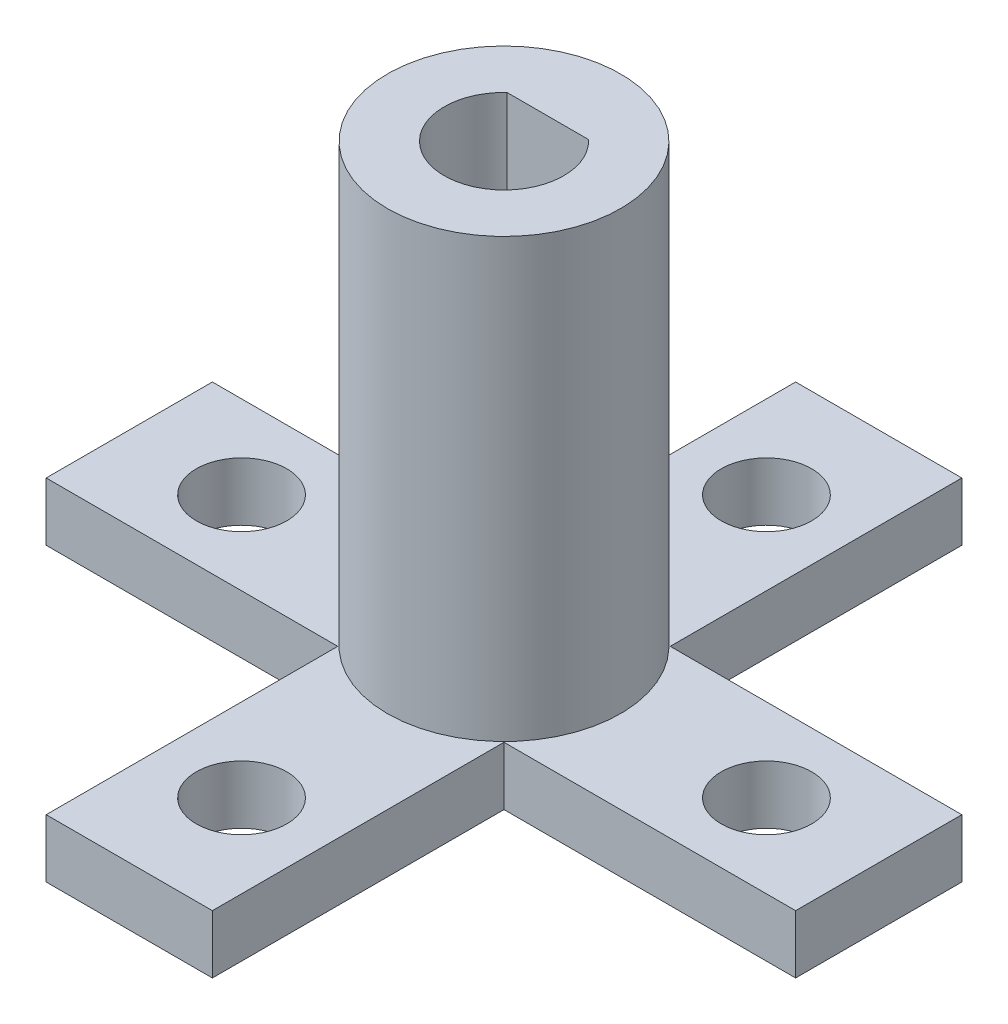
ISO-10303-21;
HEADER;
FILE_DESCRIPTION(('STEP AP214'),'2;1');
FILE_NAME('part.step','',(''),(''),'','','');
FILE_SCHEMA(('AUTOMOTIVE_DESIGN { 1 0 10303 214 1 1 1 1 }'));
ENDSEC;
DATA;
#1=APPLICATION_CONTEXT('core data for automotive mechanical design processes');
#2=APPLICATION_PROTOCOL_DEFINITION('international standard','automotive_design',2000,#1);
#3=PRODUCT_CONTEXT('',#1,'mechanical');
#4=PRODUCT('Part','Part','',(#3));
#5=PRODUCT_RELATED_PRODUCT_CATEGORY('part','',(#4));
#6=PRODUCT_DEFINITION_FORMATION('','',#4);
#7=PRODUCT_DEFINITION_CONTEXT('part definition',#1,'design');
#8=PRODUCT_DEFINITION('design','',#6,#7);
#9=PRODUCT_DEFINITION_SHAPE('','',#8);
#10=(LENGTH_UNIT() NAMED_UNIT(*) SI_UNIT(.MILLI.,.METRE.));
#11=(NAMED_UNIT(*) PLANE_ANGLE_UNIT() SI_UNIT($,.RADIAN.));
#12=(NAMED_UNIT(*) SI_UNIT($,.STERADIAN.) SOLID_ANGLE_UNIT());
#13=UNCERTAINTY_MEASURE_WITH_UNIT(LENGTH_MEASURE(1.E-05),#10,'distance_accuracy_value','');
#14=(GEOMETRIC_REPRESENTATION_CONTEXT(3) GLOBAL_UNCERTAINTY_ASSIGNED_CONTEXT((#13)) GLOBAL_UNIT_ASSIGNED_CONTEXT((#10,
#11,#12)) REPRESENTATION_CONTEXT('',''));
#15=CARTESIAN_POINT('',(0.,0.,0.));
#16=DIRECTION('',(0.,0.,1.));
#17=DIRECTION('',(1.,0.,0.));
#18=AXIS2_PLACEMENT_3D('',#15,#16,#17);
#19=CARTESIAN_POINT('',(0.,0.,-1.5));
#20=DIRECTION('',(0.,0.,1.));
#21=DIRECTION('',(1.,0.,0.));
#22=AXIS2_PLACEMENT_3D('',#19,#20,#21);
#23=PLANE('',#22);
#24=CARTESIAN_POINT('',(0.,13.,-1.5));
#25=DIRECTION('',(0.,0.,1.));
#26=DIRECTION('',(1.,0.,0.));
#27=AXIS2_PLACEMENT_3D('',#24,#25,#26);
#28=CIRCLE('',#27,1.5);
#29=CARTESIAN_POINT('',(1.39731886124821,13.5454356057318,-1.5));
#30=VERTEX_POINT('',#29);
#31=CARTESIAN_POINT('',(-1.39731886124821,13.5454356057318,-1.5));
#32=VERTEX_POINT('',#31);
#33=EDGE_CURVE('E171',#30,#32,#28,.T.);
#34=ORIENTED_EDGE('',*,*,#33,.F.);
#35=DIRECTION('',(0.,1.,0.));
#36=VECTOR('',#35,1.);
#37=CARTESIAN_POINT('',(1.39731886124821,0.,-1.5));
#38=LINE('',#37,#36);
#39=CARTESIAN_POINT('',(1.39731886124821,17.,-1.5));
#40=VERTEX_POINT('',#39);
#41=EDGE_CURVE('E188',#30,#40,#38,.T.);
#42=ORIENTED_EDGE('',*,*,#41,.T.);
#43=DIRECTION('',(1.,0.,0.));
#44=VECTOR('',#43,1.);
#45=CARTESIAN_POINT('',(0.,17.,-1.5));
#46=LINE('',#45,#44);
#47=CARTESIAN_POINT('',(-1.39731886124821,17.,-1.5));
#48=VERTEX_POINT('',#47);
#49=EDGE_CURVE('E179',#48,#40,#46,.T.);
#50=ORIENTED_EDGE('',*,*,#49,.F.);
#51=DIRECTION('',(0.,1.,0.));
#52=VECTOR('',#51,1.);
#53=CARTESIAN_POINT('',(-1.39731886124821,0.,-1.5));
#54=LINE('',#53,#52);
#55=EDGE_CURVE('E164',#32,#48,#54,.T.);
#56=ORIENTED_EDGE('',*,*,#55,.F.);
#57=EDGE_LOOP('',(#34,#42,#50,#56));
#58=FACE_BOUND('',#57,.T.);
#59=ADVANCED_FACE('F47',(#58),#23,.T.);
#60=CARTESIAN_POINT('',(0.,2.,2.85));
#61=DIRECTION('',(0.,0.,-1.));
#62=DIRECTION('',(-1.,0.,0.));
#63=AXIS2_PLACEMENT_3D('',#60,#61,#62);
#64=PLANE('',#63);
#65=DIRECTION('',(1.,0.,0.));
#66=VECTOR('',#65,1.);
#67=CARTESIAN_POINT('',(0.,0.,2.85));
#68=LINE('',#67,#66);
#69=CARTESIAN_POINT('',(-12.85,0.,2.85));
#70=VERTEX_POINT('',#69);
#71=CARTESIAN_POINT('',(-2.85,0.,2.85));
#72=VERTEX_POINT('',#71);
#73=EDGE_CURVE('E265',#70,#72,#68,.T.);
#74=ORIENTED_EDGE('',*,*,#73,.T.);
#75=DIRECTION('',(0.,-1.,0.));
#76=VECTOR('',#75,1.);
#77=CARTESIAN_POINT('',(-2.85,2.,2.85));
#78=LINE('',#77,#76);
#79=CARTESIAN_POINT('',(-2.85,2.,2.85));
#80=VERTEX_POINT('',#79);
#81=EDGE_CURVE('E56',#80,#72,#78,.T.);
#82=ORIENTED_EDGE('',*,*,#81,.F.);
#83=DIRECTION('',(1.,0.,0.));
#84=VECTOR('',#83,1.);
#85=CARTESIAN_POINT('',(0.,2.,2.85));
#86=LINE('',#85,#84);
#87=CARTESIAN_POINT('',(-12.85,2.,2.85));
#88=VERTEX_POINT('',#87);
#89=EDGE_CURVE('E205',#88,#80,#86,.T.);
#90=ORIENTED_EDGE('',*,*,#89,.F.);
#91=DIRECTION('',(0.,-1.,0.));
#92=VECTOR('',#91,1.);
#93=CARTESIAN_POINT('',(-12.85,2.,2.85));
#94=LINE('',#93,#92);
#95=EDGE_CURVE('E261',#88,#70,#94,.T.);
#96=ORIENTED_EDGE('',*,*,#95,.T.);
#97=EDGE_LOOP('',(#74,#82,#90,#96));
#98=FACE_BOUND('',#97,.T.);
#99=ADVANCED_FACE('F364',(#98),#64,.F.);
#100=CARTESIAN_POINT('',(-2.85,2.,0.));
#101=DIRECTION('',(1.,0.,0.));
#102=DIRECTION('',(0.,0.,-1.));
#103=AXIS2_PLACEMENT_3D('',#100,#101,#102);
#104=PLANE('',#103);
#105=DIRECTION('',(0.,0.,1.));
#106=VECTOR('',#105,1.);
#107=CARTESIAN_POINT('',(-2.85,0.,0.));
#108=LINE('',#107,#106);
#109=CARTESIAN_POINT('',(-2.85,0.,12.85));
#110=VERTEX_POINT('',#109);
#111=EDGE_CURVE('E269',#72,#110,#108,.T.);
#112=ORIENTED_EDGE('',*,*,#111,.T.);
#113=DIRECTION('',(0.,-1.,0.));
#114=VECTOR('',#113,1.);
#115=CARTESIAN_POINT('',(-2.85,2.,12.85));
#116=LINE('',#115,#114);
#117=CARTESIAN_POINT('',(-2.85,2.,12.85));
#118=VERTEX_POINT('',#117);
#119=EDGE_CURVE('E352',#118,#110,#116,.T.);
#120=ORIENTED_EDGE('',*,*,#119,.F.);
#121=DIRECTION('',(0.,0.,1.));
#122=VECTOR('',#121,1.);
#123=CARTESIAN_POINT('',(-2.85,2.,0.));
#124=LINE('',#123,#122);
#125=EDGE_CURVE('E210',#80,#118,#124,.T.);
#126=ORIENTED_EDGE('',*,*,#125,.F.);
#127=ORIENTED_EDGE('',*,*,#81,.T.);
#128=EDGE_LOOP('',(#112,#120,#126,#127));
#129=FACE_BOUND('',#128,.T.);
#130=ADVANCED_FACE('F359',(#129),#104,.F.);
#131=CARTESIAN_POINT('',(0.,2.,12.85));
#132=DIRECTION('',(0.,0.,-1.));
#133=DIRECTION('',(-1.,0.,0.));
#134=AXIS2_PLACEMENT_3D('',#131,#132,#133);
#135=PLANE('',#134);
#136=DIRECTION('',(1.,0.,0.));
#137=VECTOR('',#136,1.);
#138=CARTESIAN_POINT('',(0.,0.,12.85));
#139=LINE('',#138,#137);
#140=CARTESIAN_POINT('',(2.85,0.,12.85));
#141=VERTEX_POINT('',#140);
#142=EDGE_CURVE('E272',#110,#141,#139,.T.);
#143=ORIENTED_EDGE('',*,*,#142,.T.);
#144=DIRECTION('',(0.,-1.,0.));
#145=VECTOR('',#144,1.);
#146=CARTESIAN_POINT('',(2.85,2.,12.85));
#147=LINE('',#146,#145);
#148=CARTESIAN_POINT('',(2.85,2.,12.85));
#149=VERTEX_POINT('',#148);
#150=EDGE_CURVE('E349',#149,#141,#147,.T.);
#151=ORIENTED_EDGE('',*,*,#150,.F.);
#152=DIRECTION('',(1.,0.,0.));
#153=VECTOR('',#152,1.);
#154=CARTESIAN_POINT('',(0.,2.,12.85));
#155=LINE('',#154,#153);
#156=EDGE_CURVE('E213',#118,#149,#155,.T.);
#157=ORIENTED_EDGE('',*,*,#156,.F.);
#158=ORIENTED_EDGE('',*,*,#119,.T.);
#159=EDGE_LOOP('',(#143,#151,#157,#158));
#160=FACE_BOUND('',#159,.T.);
#161=ADVANCED_FACE('F410',(#160),#135,.F.);
#162=CARTESIAN_POINT('',(2.85,2.,0.));
#163=DIRECTION('',(1.,0.,0.));
#164=DIRECTION('',(0.,0.,-1.));
#165=AXIS2_PLACEMENT_3D('',#162,#163,#164);
#166=PLANE('',#165);
#167=DIRECTION('',(0.,0.,1.));
#168=VECTOR('',#167,1.);
#169=CARTESIAN_POINT('',(2.85,0.,0.));
#170=LINE('',#169,#168);
#171=CARTESIAN_POINT('',(2.85,0.,2.85));
#172=VERTEX_POINT('',#171);
#173=EDGE_CURVE('E276',#172,#141,#170,.T.);
#174=ORIENTED_EDGE('',*,*,#173,.F.);
#175=DIRECTION('',(0.,-1.,0.));
#176=VECTOR('',#175,1.);
#177=CARTESIAN_POINT('',(2.85,2.,2.85));
#178=LINE('',#177,#176);
#179=CARTESIAN_POINT('',(2.85,2.,2.85));
#180=VERTEX_POINT('',#179);
#181=EDGE_CURVE('E346',#180,#172,#178,.T.);
#182=ORIENTED_EDGE('',*,*,#181,.F.);
#183=DIRECTION('',(0.,0.,1.));
#184=VECTOR('',#183,1.);
#185=CARTESIAN_POINT('',(2.85,2.,0.));
#186=LINE('',#185,#184);
#187=EDGE_CURVE('E216',#180,#149,#186,.T.);
#188=ORIENTED_EDGE('',*,*,#187,.T.);
#189=ORIENTED_EDGE('',*,*,#150,.T.);
#190=EDGE_LOOP('',(#174,#182,#188,#189));
#191=FACE_BOUND('',#190,.T.);
#192=ADVANCED_FACE('F406',(#191),#166,.T.);
#193=CARTESIAN_POINT('',(0.,2.,2.85));
#194=DIRECTION('',(0.,0.,-1.));
#195=DIRECTION('',(-1.,0.,0.));
#196=AXIS2_PLACEMENT_3D('',#193,#194,#195);
#197=PLANE('',#196);
#198=DIRECTION('',(1.,0.,0.));
#199=VECTOR('',#198,1.);
#200=CARTESIAN_POINT('',(0.,0.,2.85));
#201=LINE('',#200,#199);
#202=CARTESIAN_POINT('',(12.85,0.,2.85));
#203=VERTEX_POINT('',#202);
#204=EDGE_CURVE('E280',#172,#203,#201,.T.);
#205=ORIENTED_EDGE('',*,*,#204,.T.);
#206=DIRECTION('',(0.,-1.,0.));
#207=VECTOR('',#206,1.);
#208=CARTESIAN_POINT('',(12.85,2.,2.85));
#209=LINE('',#208,#207);
#210=CARTESIAN_POINT('',(12.85,2.,2.85));
#211=VERTEX_POINT('',#210);
#212=EDGE_CURVE('E342',#211,#203,#209,.T.);
#213=ORIENTED_EDGE('',*,*,#212,.F.);
#214=DIRECTION('',(1.,0.,0.));
#215=VECTOR('',#214,1.);
#216=CARTESIAN_POINT('',(0.,2.,2.85));
#217=LINE('',#216,#215);
#218=EDGE_CURVE('E220',#180,#211,#217,.T.);
#219=ORIENTED_EDGE('',*,*,#218,.F.);
#220=ORIENTED_EDGE('',*,*,#181,.T.);
#221=EDGE_LOOP('',(#205,#213,#219,#220));
#222=FACE_BOUND('',#221,.T.);
#223=ADVANCED_FACE('F402',(#222),#197,.F.);
#224=CARTESIAN_POINT('',(12.85,2.,0.));
#225=DIRECTION('',(-1.,0.,0.));
#226=DIRECTION('',(0.,0.,1.));
#227=AXIS2_PLACEMENT_3D('',#224,#225,#226);
#228=PLANE('',#227);
#229=DIRECTION('',(0.,0.,-1.));
#230=VECTOR('',#229,1.);
#231=CARTESIAN_POINT('',(12.85,0.,0.));
#232=LINE('',#231,#230);
#233=CARTESIAN_POINT('',(12.85,0.,-2.85));
#234=VERTEX_POINT('',#233);
#235=EDGE_CURVE('E283',#203,#234,#232,.T.);
#236=ORIENTED_EDGE('',*,*,#235,.T.);
#237=DIRECTION('',(0.,-1.,0.));
#238=VECTOR('',#237,1.);
#239=CARTESIAN_POINT('',(12.85,2.,-2.85));
#240=LINE('',#239,#238);
#241=CARTESIAN_POINT('',(12.85,2.,-2.85));
#242=VERTEX_POINT('',#241);
#243=EDGE_CURVE('E339',#242,#234,#240,.T.);
#244=ORIENTED_EDGE('',*,*,#243,.F.);
#245=DIRECTION('',(0.,0.,-1.));
#246=VECTOR('',#245,1.);
#247=CARTESIAN_POINT('',(12.85,2.,0.));
#248=LINE('',#247,#246);
#249=EDGE_CURVE('E223',#211,#242,#248,.T.);
#250=ORIENTED_EDGE('',*,*,#249,.F.);
#251=ORIENTED_EDGE('',*,*,#212,.T.);
#252=EDGE_LOOP('',(#236,#244,#250,#251));
#253=FACE_BOUND('',#252,.T.);
#254=ADVANCED_FACE('F398',(#253),#228,.F.);
#255=CARTESIAN_POINT('',(0.,2.,-2.85));
#256=DIRECTION('',(0.,0.,-1.));
#257=DIRECTION('',(-1.,0.,0.));
#258=AXIS2_PLACEMENT_3D('',#255,#256,#257);
#259=PLANE('',#258);
#260=DIRECTION('',(1.,0.,0.));
#261=VECTOR('',#260,1.);
#262=CARTESIAN_POINT('',(0.,0.,-2.85));
#263=LINE('',#262,#261);
#264=CARTESIAN_POINT('',(2.85,0.,-2.85));
#265=VERTEX_POINT('',#264);
#266=EDGE_CURVE('E287',#265,#234,#263,.T.);
#267=ORIENTED_EDGE('',*,*,#266,.F.);
#268=DIRECTION('',(0.,-1.,0.));
#269=VECTOR('',#268,1.);
#270=CARTESIAN_POINT('',(2.85,2.,-2.85));
#271=LINE('',#270,#269);
#272=CARTESIAN_POINT('',(2.85,2.,-2.85));
#273=VERTEX_POINT('',#272);
#274=EDGE_CURVE('E336',#273,#265,#271,.T.);
#275=ORIENTED_EDGE('',*,*,#274,.F.);
#276=DIRECTION('',(1.,0.,0.));
#277=VECTOR('',#276,1.);
#278=CARTESIAN_POINT('',(0.,2.,-2.85));
#279=LINE('',#278,#277);
#280=EDGE_CURVE('E226',#273,#242,#279,.T.);
#281=ORIENTED_EDGE('',*,*,#280,.T.);
#282=ORIENTED_EDGE('',*,*,#243,.T.);
#283=EDGE_LOOP('',(#267,#275,#281,#282));
#284=FACE_BOUND('',#283,.T.);
#285=ADVANCED_FACE('F393',(#284),#259,.T.);
#286=CARTESIAN_POINT('',(2.85,2.,0.));
#287=DIRECTION('',(1.,0.,0.));
#288=DIRECTION('',(0.,0.,-1.));
#289=AXIS2_PLACEMENT_3D('',#286,#287,#288);
#290=PLANE('',#289);
#291=DIRECTION('',(0.,0.,1.));
#292=VECTOR('',#291,1.);
#293=CARTESIAN_POINT('',(2.85,0.,0.));
#294=LINE('',#293,#292);
#295=CARTESIAN_POINT('',(2.85,0.,-12.85));
#296=VERTEX_POINT('',#295);
#297=EDGE_CURVE('E291',#296,#265,#294,.T.);
#298=ORIENTED_EDGE('',*,*,#297,.F.);
#299=DIRECTION('',(0.,-1.,0.));
#300=VECTOR('',#299,1.);
#301=CARTESIAN_POINT('',(2.85,2.,-12.85));
#302=LINE('',#301,#300);
#303=CARTESIAN_POINT('',(2.85,2.,-12.85));
#304=VERTEX_POINT('',#303);
#305=EDGE_CURVE('E333',#304,#296,#302,.T.);
#306=ORIENTED_EDGE('',*,*,#305,.F.);
#307=DIRECTION('',(0.,0.,1.));
#308=VECTOR('',#307,1.);
#309=CARTESIAN_POINT('',(2.85,2.,0.));
#310=LINE('',#309,#308);
#311=EDGE_CURVE('E230',#304,#273,#310,.T.);
#312=ORIENTED_EDGE('',*,*,#311,.T.);
#313=ORIENTED_EDGE('',*,*,#274,.T.);
#314=EDGE_LOOP('',(#298,#306,#312,#313));
#315=FACE_BOUND('',#314,.T.);
#316=ADVANCED_FACE('F388',(#315),#290,.T.);
#317=CARTESIAN_POINT('',(0.,2.,-12.85));
#318=DIRECTION('',(0.,0.,-1.));
#319=DIRECTION('',(-1.,0.,0.));
#320=AXIS2_PLACEMENT_3D('',#317,#318,#319);
#321=PLANE('',#320);
#322=DIRECTION('',(1.,0.,0.));
#323=VECTOR('',#322,1.);
#324=CARTESIAN_POINT('',(0.,0.,-12.85));
#325=LINE('',#324,#323);
#326=CARTESIAN_POINT('',(-2.85,0.,-12.85));
#327=VERTEX_POINT('',#326);
#328=EDGE_CURVE('E295',#327,#296,#325,.T.);
#329=ORIENTED_EDGE('',*,*,#328,.F.);
#330=DIRECTION('',(0.,-1.,0.));
#331=VECTOR('',#330,1.);
#332=CARTESIAN_POINT('',(-2.85,2.,-12.85));
#333=LINE('',#332,#331);
#334=CARTESIAN_POINT('',(-2.85,2.,-12.85));
#335=VERTEX_POINT('',#334);
#336=EDGE_CURVE('E330',#335,#327,#333,.T.);
#337=ORIENTED_EDGE('',*,*,#336,.F.);
#338=DIRECTION('',(1.,0.,0.));
#339=VECTOR('',#338,1.);
#340=CARTESIAN_POINT('',(0.,2.,-12.85));
#341=LINE('',#340,#339);
#342=EDGE_CURVE('E234',#335,#304,#341,.T.);
#343=ORIENTED_EDGE('',*,*,#342,.T.);
#344=ORIENTED_EDGE('',*,*,#305,.T.);
#345=EDGE_LOOP('',(#329,#337,#343,#344));
#346=FACE_BOUND('',#345,.T.);
#347=ADVANCED_FACE('F382',(#346),#321,.T.);
#348=CARTESIAN_POINT('',(-2.85,2.,0.));
#349=DIRECTION('',(1.,0.,0.));
#350=DIRECTION('',(0.,0.,-1.));
#351=AXIS2_PLACEMENT_3D('',#348,#349,#350);
#352=PLANE('',#351);
#353=DIRECTION('',(0.,0.,1.));
#354=VECTOR('',#353,1.);
#355=CARTESIAN_POINT('',(-2.85,0.,0.));
#356=LINE('',#355,#354);
#357=CARTESIAN_POINT('',(-2.85,0.,-2.85));
#358=VERTEX_POINT('',#357);
#359=EDGE_CURVE('E299',#327,#358,#356,.T.);
#360=ORIENTED_EDGE('',*,*,#359,.T.);
#361=DIRECTION('',(0.,-1.,0.));
#362=VECTOR('',#361,1.);
#363=CARTESIAN_POINT('',(-2.85,2.,-2.85));
#364=LINE('',#363,#362);
#365=CARTESIAN_POINT('',(-2.85,2.,-2.85));
#366=VERTEX_POINT('',#365);
#367=EDGE_CURVE('E327',#366,#358,#364,.T.);
#368=ORIENTED_EDGE('',*,*,#367,.F.);
#369=DIRECTION('',(0.,0.,1.));
#370=VECTOR('',#369,1.);
#371=CARTESIAN_POINT('',(-2.85,2.,0.));
#372=LINE('',#371,#370);
#373=EDGE_CURVE('E238',#335,#366,#372,.T.);
#374=ORIENTED_EDGE('',*,*,#373,.F.);
#375=ORIENTED_EDGE('',*,*,#336,.T.);
#376=EDGE_LOOP('',(#360,#368,#374,#375));
#377=FACE_BOUND('',#376,.T.);
#378=ADVANCED_FACE('F414',(#377),#352,.F.);
#379=CARTESIAN_POINT('',(0.,2.,-2.85));
#380=DIRECTION('',(0.,0.,-1.));
#381=DIRECTION('',(-1.,0.,0.));
#382=AXIS2_PLACEMENT_3D('',#379,#380,#381);
#383=PLANE('',#382);
#384=DIRECTION('',(1.,0.,0.));
#385=VECTOR('',#384,1.);
#386=CARTESIAN_POINT('',(0.,0.,-2.85));
#387=LINE('',#386,#385);
#388=CARTESIAN_POINT('',(-12.85,0.,-2.85));
#389=VERTEX_POINT('',#388);
#390=EDGE_CURVE('E303',#389,#358,#387,.T.);
#391=ORIENTED_EDGE('',*,*,#390,.F.);
#392=DIRECTION('',(0.,-1.,0.));
#393=VECTOR('',#392,1.);
#394=CARTESIAN_POINT('',(-12.85,2.,-2.85));
#395=LINE('',#394,#393);
#396=CARTESIAN_POINT('',(-12.85,2.,-2.85));
#397=VERTEX_POINT('',#396);
#398=EDGE_CURVE('E324',#397,#389,#395,.T.);
#399=ORIENTED_EDGE('',*,*,#398,.F.);
#400=DIRECTION('',(1.,0.,0.));
#401=VECTOR('',#400,1.);
#402=CARTESIAN_POINT('',(0.,2.,-2.85));
#403=LINE('',#402,#401);
#404=EDGE_CURVE('E241',#397,#366,#403,.T.);
#405=ORIENTED_EDGE('',*,*,#404,.T.);
#406=ORIENTED_EDGE('',*,*,#367,.T.);
#407=EDGE_LOOP('',(#391,#399,#405,#406));
#408=FACE_BOUND('',#407,.T.);
#409=ADVANCED_FACE('F376',(#408),#383,.T.);
#410=CARTESIAN_POINT('',(0.,2.,-9.));
#411=DIRECTION('',(0.,-1.,0.));
#412=DIRECTION('',(0.,0.,-1.));
#413=AXIS2_PLACEMENT_3D('',#410,#411,#412);
#414=CYLINDRICAL_SURFACE('',#413,1.55);
#415=CARTESIAN_POINT('',(0.,2.,-9.));
#416=DIRECTION('',(0.,1.,0.));
#417=DIRECTION('',(0.,0.,1.));
#418=AXIS2_PLACEMENT_3D('',#415,#416,#417);
#419=CIRCLE('',#418,1.55);
#420=CARTESIAN_POINT('',(0.,2.,-7.45));
#421=VERTEX_POINT('',#420);
#422=EDGE_CURVE('E253',#421,#421,#419,.T.);
#423=ORIENTED_EDGE('',*,*,#422,.T.);
#424=EDGE_LOOP('',(#423));
#425=FACE_BOUND('',#424,.T.);
#426=CARTESIAN_POINT('',(0.,0.,-9.));
#427=DIRECTION('',(0.,1.,0.));
#428=DIRECTION('',(0.,0.,1.));
#429=AXIS2_PLACEMENT_3D('',#426,#427,#428);
#430=CIRCLE('',#429,1.55);
#431=CARTESIAN_POINT('',(0.,0.,-7.45));
#432=VERTEX_POINT('',#431);
#433=EDGE_CURVE('E315',#432,#432,#430,.T.);
#434=ORIENTED_EDGE('',*,*,#433,.F.);
#435=EDGE_LOOP('',(#434));
#436=FACE_BOUND('',#435,.T.);
#437=ADVANCED_FACE('F421',(#425,#436),#414,.F.);
#438=CARTESIAN_POINT('',(0.,2.,9.));
#439=DIRECTION('',(0.,-1.,0.));
#440=DIRECTION('',(0.,0.,-1.));
#441=AXIS2_PLACEMENT_3D('',#438,#439,#440);
#442=CYLINDRICAL_SURFACE('',#441,1.55);
#443=CARTESIAN_POINT('',(0.,2.,9.));
#444=DIRECTION('',(0.,1.,0.));
#445=DIRECTION('',(0.,0.,1.));
#446=AXIS2_PLACEMENT_3D('',#443,#444,#445);
#447=CIRCLE('',#446,1.55);
#448=CARTESIAN_POINT('',(0.,2.,10.55));
#449=VERTEX_POINT('',#448);
#450=EDGE_CURVE('E249',#449,#449,#447,.T.);
#451=ORIENTED_EDGE('',*,*,#450,.T.);
#452=EDGE_LOOP('',(#451));
#453=FACE_BOUND('',#452,.T.);
#454=CARTESIAN_POINT('',(0.,0.,9.));
#455=DIRECTION('',(0.,1.,0.));
#456=DIRECTION('',(0.,0.,1.));
#457=AXIS2_PLACEMENT_3D('',#454,#455,#456);
#458=CIRCLE('',#457,1.55);
#459=CARTESIAN_POINT('',(0.,0.,10.55));
#460=VERTEX_POINT('',#459);
#461=EDGE_CURVE('E311',#460,#460,#458,.T.);
#462=ORIENTED_EDGE('',*,*,#461,.F.);
#463=EDGE_LOOP('',(#462));
#464=FACE_BOUND('',#463,.T.);
#465=ADVANCED_FACE('F486',(#453,#464),#442,.F.);
#466=CARTESIAN_POINT('',(-12.85,2.,0.));
#467=DIRECTION('',(-1.,0.,0.));
#468=DIRECTION('',(0.,0.,1.));
#469=AXIS2_PLACEMENT_3D('',#466,#467,#468);
#470=PLANE('',#469);
#471=DIRECTION('',(0.,0.,-1.));
#472=VECTOR('',#471,1.);
#473=CARTESIAN_POINT('',(-12.85,0.,0.));
#474=LINE('',#473,#472);
#475=EDGE_CURVE('E307',#70,#389,#474,.T.);
#476=ORIENTED_EDGE('',*,*,#475,.F.);
#477=ORIENTED_EDGE('',*,*,#95,.F.);
#478=DIRECTION('',(0.,0.,-1.));
#479=VECTOR('',#478,1.);
#480=CARTESIAN_POINT('',(-12.85,2.,0.));
#481=LINE('',#480,#479);
#482=EDGE_CURVE('E245',#88,#397,#481,.T.);
#483=ORIENTED_EDGE('',*,*,#482,.T.);
#484=ORIENTED_EDGE('',*,*,#398,.T.);
#485=EDGE_LOOP('',(#476,#477,#483,#484));
#486=FACE_BOUND('',#485,.T.);
#487=ADVANCED_FACE('F371',(#486),#470,.T.);
#488=CARTESIAN_POINT('',(-9.,2.,0.));
#489=DIRECTION('',(0.,-1.,0.));
#490=DIRECTION('',(0.,0.,-1.));
#491=AXIS2_PLACEMENT_3D('',#488,#489,#490);
#492=CYLINDRICAL_SURFACE('',#491,1.55);
#493=CARTESIAN_POINT('',(-9.,2.,0.));
#494=DIRECTION('',(0.,1.,0.));
#495=DIRECTION('',(0.,0.,1.));
#496=AXIS2_PLACEMENT_3D('',#493,#494,#495);
#497=CIRCLE('',#496,1.55);
#498=CARTESIAN_POINT('',(-9.,2.,1.54999999999991));
#499=VERTEX_POINT('',#498);
#500=EDGE_CURVE('E201',#499,#499,#497,.T.);
#501=ORIENTED_EDGE('',*,*,#500,.T.);
#502=EDGE_LOOP('',(#501));
#503=FACE_BOUND('',#502,.T.);
#504=CARTESIAN_POINT('',(-9.,0.,0.));
#505=DIRECTION('',(0.,1.,0.));
#506=DIRECTION('',(0.,0.,1.));
#507=AXIS2_PLACEMENT_3D('',#504,#505,#506);
#508=CIRCLE('',#507,1.55);
#509=CARTESIAN_POINT('',(-9.,0.,1.54999999999991));
#510=VERTEX_POINT('',#509);
#511=EDGE_CURVE('E197',#510,#510,#508,.T.);
#512=ORIENTED_EDGE('',*,*,#511,.F.);
#513=EDGE_LOOP('',(#512));
#514=FACE_BOUND('',#513,.T.);
#515=ADVANCED_FACE('F49',(#503,#514),#492,.F.);
#516=CARTESIAN_POINT('',(9.,2.,0.));
#517=DIRECTION('',(0.,-1.,0.));
#518=DIRECTION('',(0.,0.,-1.));
#519=AXIS2_PLACEMENT_3D('',#516,#517,#518);
#520=CYLINDRICAL_SURFACE('',#519,1.55);
#521=CARTESIAN_POINT('',(9.,2.,0.));
#522=DIRECTION('',(0.,1.,0.));
#523=DIRECTION('',(0.,0.,1.));
#524=AXIS2_PLACEMENT_3D('',#521,#522,#523);
#525=CIRCLE('',#524,1.55);
#526=CARTESIAN_POINT('',(9.,2.,1.55000000000003));
#527=VERTEX_POINT('',#526);
#528=EDGE_CURVE('E257',#527,#527,#525,.T.);
#529=ORIENTED_EDGE('',*,*,#528,.T.);
#530=EDGE_LOOP('',(#529));
#531=FACE_BOUND('',#530,.T.);
#532=CARTESIAN_POINT('',(9.,0.,0.));
#533=DIRECTION('',(0.,1.,0.));
#534=DIRECTION('',(0.,0.,1.));
#535=AXIS2_PLACEMENT_3D('',#532,#533,#534);
#536=CIRCLE('',#535,1.55);
#537=CARTESIAN_POINT('',(9.,0.,1.55000000000003));
#538=VERTEX_POINT('',#537);
#539=EDGE_CURVE('E206',#538,#538,#536,.T.);
#540=ORIENTED_EDGE('',*,*,#539,.F.);
#541=EDGE_LOOP('',(#540));
#542=FACE_BOUND('',#541,.T.);
#543=ADVANCED_FACE('F468',(#531,#542),#520,.F.);
#544=CARTESIAN_POINT('',(0.,2.,0.));
#545=DIRECTION('',(0.,1.,0.));
#546=DIRECTION('',(0.,0.,1.));
#547=AXIS2_PLACEMENT_3D('',#544,#545,#546);
#548=PLANE('',#547);
#549=CARTESIAN_POINT('',(0.,2.,0.));
#550=DIRECTION('',(0.,1.,0.));
#551=DIRECTION('',(0.,0.,1.));
#552=AXIS2_PLACEMENT_3D('',#549,#550,#551);
#553=CIRCLE('',#552,4.);
#554=CARTESIAN_POINT('',(0.,2.,4.));
#555=VERTEX_POINT('',#554);
#556=EDGE_CURVE('E186',#555,#555,#553,.T.);
#557=ORIENTED_EDGE('',*,*,#556,.F.);
#558=EDGE_LOOP('',(#557));
#559=FACE_BOUND('',#558,.T.);
#560=ORIENTED_EDGE('',*,*,#500,.F.);
#561=EDGE_LOOP('',(#560));
#562=FACE_BOUND('',#561,.T.);
#563=ORIENTED_EDGE('',*,*,#89,.T.);
#564=ORIENTED_EDGE('',*,*,#125,.T.);
#565=ORIENTED_EDGE('',*,*,#156,.T.);
#566=ORIENTED_EDGE('',*,*,#187,.F.);
#567=ORIENTED_EDGE('',*,*,#218,.T.);
#568=ORIENTED_EDGE('',*,*,#249,.T.);
#569=ORIENTED_EDGE('',*,*,#280,.F.);
#570=ORIENTED_EDGE('',*,*,#311,.F.);
#571=ORIENTED_EDGE('',*,*,#342,.F.);
#572=ORIENTED_EDGE('',*,*,#373,.T.);
#573=ORIENTED_EDGE('',*,*,#404,.F.);
#574=ORIENTED_EDGE('',*,*,#482,.F.);
#575=EDGE_LOOP('',(#563,#564,#565,#566,#567,#568,#569,#570,#571,#572,#573,#574));
#576=FACE_BOUND('',#575,.T.);
#577=ORIENTED_EDGE('',*,*,#450,.F.);
#578=EDGE_LOOP('',(#577));
#579=FACE_BOUND('',#578,.T.);
#580=ORIENTED_EDGE('',*,*,#422,.F.);
#581=EDGE_LOOP('',(#580));
#582=FACE_BOUND('',#581,.T.);
#583=ORIENTED_EDGE('',*,*,#528,.F.);
#584=EDGE_LOOP('',(#583));
#585=FACE_BOUND('',#584,.T.);
#586=ADVANCED_FACE('F412',(#559,#562,#576,#579,#582,#585),#548,.T.);
#587=CARTESIAN_POINT('',(0.,0.,0.));
#588=DIRECTION('',(0.,1.,0.));
#589=DIRECTION('',(0.,0.,1.));
#590=AXIS2_PLACEMENT_3D('',#587,#588,#589);
#591=PLANE('',#590);
#592=DIRECTION('',(1.,0.,0.));
#593=VECTOR('',#592,1.);
#594=CARTESIAN_POINT('',(0.,0.,-1.5));
#595=LINE('',#594,#593);
#596=CARTESIAN_POINT('',(-1.39731886124821,0.,-1.5));
#597=VERTEX_POINT('',#596);
#598=CARTESIAN_POINT('',(1.39731886124821,0.,-1.5));
#599=VERTEX_POINT('',#598);
#600=EDGE_CURVE('E441',#597,#599,#595,.T.);
#601=ORIENTED_EDGE('',*,*,#600,.F.);
#602=CARTESIAN_POINT('',(0.,0.,0.));
#603=DIRECTION('',(0.,1.,0.));
#604=DIRECTION('',(0.,0.,1.));
#605=AXIS2_PLACEMENT_3D('',#602,#603,#604);
#606=CIRCLE('',#605,2.05);
#607=EDGE_CURVE('E70',#597,#599,#606,.T.);
#608=ORIENTED_EDGE('',*,*,#607,.T.);
#609=EDGE_LOOP('',(#601,#608));
#610=FACE_BOUND('',#609,.T.);
#611=ORIENTED_EDGE('',*,*,#511,.T.);
#612=EDGE_LOOP('',(#611));
#613=FACE_BOUND('',#612,.T.);
#614=ORIENTED_EDGE('',*,*,#73,.F.);
#615=ORIENTED_EDGE('',*,*,#475,.T.);
#616=ORIENTED_EDGE('',*,*,#390,.T.);
#617=ORIENTED_EDGE('',*,*,#359,.F.);
#618=ORIENTED_EDGE('',*,*,#328,.T.);
#619=ORIENTED_EDGE('',*,*,#297,.T.);
#620=ORIENTED_EDGE('',*,*,#266,.T.);
#621=ORIENTED_EDGE('',*,*,#235,.F.);
#622=ORIENTED_EDGE('',*,*,#204,.F.);
#623=ORIENTED_EDGE('',*,*,#173,.T.);
#624=ORIENTED_EDGE('',*,*,#142,.F.);
#625=ORIENTED_EDGE('',*,*,#111,.F.);
#626=EDGE_LOOP('',(#614,#615,#616,#617,#618,#619,#620,#621,#622,#623,#624,#625));
#627=FACE_BOUND('',#626,.T.);
#628=ORIENTED_EDGE('',*,*,#461,.T.);
#629=EDGE_LOOP('',(#628));
#630=FACE_BOUND('',#629,.T.);
#631=ORIENTED_EDGE('',*,*,#433,.T.);
#632=EDGE_LOOP('',(#631));
#633=FACE_BOUND('',#632,.T.);
#634=ORIENTED_EDGE('',*,*,#539,.T.);
#635=EDGE_LOOP('',(#634));
#636=FACE_BOUND('',#635,.T.);
#637=ADVANCED_FACE('F367',(#610,#613,#627,#630,#633,#636),#591,.F.);
#638=CARTESIAN_POINT('',(0.,17.,0.));
#639=DIRECTION('',(0.,-1.,0.));
#640=DIRECTION('',(0.,0.,-1.));
#641=AXIS2_PLACEMENT_3D('',#638,#639,#640);
#642=CYLINDRICAL_SURFACE('',#641,4.);
#643=CARTESIAN_POINT('',(0.,14.5,-4.));
#644=CARTESIAN_POINT('',(-0.0812350589378528,14.5000029023031,-4.00000217456151));
#645=CARTESIAN_POINT('',(-0.162450241781792,14.4933802397516,-3.99750379283184));
#646=CARTESIAN_POINT('',(-0.322453452352361,14.4671718047301,-3.98778696006928));
#647=CARTESIAN_POINT('',(-0.401241827987616,14.4475878995294,-3.98056918893993));
#648=CARTESIAN_POINT('',(-0.554060784990879,14.3962469982282,-3.96218832391545));
#649=CARTESIAN_POINT('',(-0.628100224162278,14.3645134831782,-3.9510328434944));
#650=CARTESIAN_POINT('',(-0.769799310160254,14.2898935869842,-3.92588767765353));
#651=CARTESIAN_POINT('',(-0.837457239177879,14.2470042144558,-3.91189723227548));
#652=CARTESIAN_POINT('',(-0.967346417045826,14.1493874689291,-3.88186246971217));
#653=CARTESIAN_POINT('',(-1.02927073015119,14.0942697377406,-3.86576002583566));
#654=CARTESIAN_POINT('',(-1.14324421474363,13.9745895653412,-3.83360220871327));
#655=CARTESIAN_POINT('',(-1.19529036359203,13.9100242439121,-3.81754685135033));
#656=CARTESIAN_POINT('',(-1.28998202215985,13.7702825324768,-3.78662470617731));
#657=CARTESIAN_POINT('',(-1.3321939319576,13.6947956334542,-3.77182648820818));
#658=CARTESIAN_POINT('',(-1.40318646334084,13.5371516458315,-3.74599860237433));
#659=CARTESIAN_POINT('',(-1.43197244961239,13.4549972368449,-3.73496742975881));
#660=CARTESIAN_POINT('',(-1.47408431017549,13.2898832597418,-3.71854412824136));
#661=CARTESIAN_POINT('',(-1.48799593218558,13.2070949615646,-3.71293924350838));
#662=CARTESIAN_POINT('',(-1.50179556531648,13.0401838420062,-3.70738061461215));
#663=CARTESIAN_POINT('',(-1.5016893680263,12.9560615861255,-3.70742453659305));
#664=CARTESIAN_POINT('',(-1.48790429610018,12.794230474787,-3.71297511632055));
#665=CARTESIAN_POINT('',(-1.47503808509003,12.7164390939558,-3.71815468871122));
#666=CARTESIAN_POINT('',(-1.4374416786833,12.5642128495947,-3.7328493805953));
#667=CARTESIAN_POINT('',(-1.41270969663258,12.4897784933861,-3.74236515298863));
#668=CARTESIAN_POINT('',(-1.35163748571904,12.3447229322718,-3.76485702190253));
#669=CARTESIAN_POINT('',(-1.315086487371,12.2742005138787,-3.77789517988166));
#670=CARTESIAN_POINT('',(-1.23156073762698,12.140054262409,-3.80594210139319));
#671=CARTESIAN_POINT('',(-1.18458238728896,12.0764328224803,-3.82095154457158));
#672=CARTESIAN_POINT('',(-1.07781780766549,11.9533963363491,-3.85248038859113));
#673=CARTESIAN_POINT('',(-1.01738298716955,11.8945513592519,-3.86903347455671));
#674=CARTESIAN_POINT('',(-0.887312590819019,11.7876620337942,-3.90091728164086));
#675=CARTESIAN_POINT('',(-0.817675603497362,11.7396193453943,-3.91624781465952));
#676=CARTESIAN_POINT('',(-0.669723436992418,11.6550696029375,-3.9442639480908));
#677=CARTESIAN_POINT('',(-0.591290713844718,11.6187524187789,-3.95690498259616));
#678=CARTESIAN_POINT('',(-0.428836850524582,11.56001739573,-3.97778718326962));
#679=CARTESIAN_POINT('',(-0.344818210845766,11.5375933834389,-3.98603030341493));
#680=CARTESIAN_POINT('',(-0.178375243148664,11.5083772124581,-3.99684443228065));
#681=CARTESIAN_POINT('',(-0.0961036195622081,11.5008173936175,-3.99969369025686));
#682=CARTESIAN_POINT('',(0.0685724752550254,11.4993089361001,-4.00025893700126));
#683=CARTESIAN_POINT('',(0.150976912983374,11.5053572796832,-3.99797606386863));
#684=CARTESIAN_POINT('',(0.31026204856186,11.5303100423087,-3.98871709772643));
#685=CARTESIAN_POINT('',(0.387233328007337,11.5487115437371,-3.98192470962305));
#686=CARTESIAN_POINT('',(0.536941754957222,11.5971860725473,-3.96451477091717));
#687=CARTESIAN_POINT('',(0.609678350347536,11.627260617948,-3.9538967228203));
#688=CARTESIAN_POINT('',(0.751247765110156,11.6991864124395,-3.92949624407681));
#689=CARTESIAN_POINT('',(0.819903083557796,11.7413577292234,-3.91563000209348));
#690=CARTESIAN_POINT('',(0.949392711726626,11.8359181031716,-3.88626671564664));
#691=CARTESIAN_POINT('',(1.01022412027045,11.8883109325452,-3.87076907009516));
#692=CARTESIAN_POINT('',(1.12603079874454,12.0054041221243,-3.8387332949099));
#693=CARTESIAN_POINT('',(1.18046154123569,12.0706421827727,-3.82218696503729));
#694=CARTESIAN_POINT('',(1.27771050031903,12.2096513847077,-3.79078815746854));
#695=CARTESIAN_POINT('',(1.32052767414518,12.2834232913885,-3.77593583194399));
#696=CARTESIAN_POINT('',(1.39337773518998,12.4380159867723,-3.74966829822463));
#697=CARTESIAN_POINT('',(1.42335685446918,12.5188647459104,-3.73826760328493));
#698=CARTESIAN_POINT('',(1.46907883466889,12.6850097636878,-3.72054032891005));
#699=CARTESIAN_POINT('',(1.48483050305535,12.7703032361981,-3.71421061057491));
#700=CARTESIAN_POINT('',(1.50086347097839,12.9370161595411,-3.70775894792573));
#701=CARTESIAN_POINT('',(1.50207331495837,13.0183326317169,-3.70726444523341));
#702=CARTESIAN_POINT('',(1.49136715641593,13.1799453162762,-3.71158412745292));
#703=CARTESIAN_POINT('',(1.47945239850124,13.2602416246716,-3.71639780898899));
#704=CARTESIAN_POINT('',(1.44355815630242,13.4150472267166,-3.73048141585432));
#705=CARTESIAN_POINT('',(1.41995798316524,13.4896583462453,-3.73961085376663));
#706=CARTESIAN_POINT('',(1.3616969677992,13.6339055084944,-3.76121548297845));
#707=CARTESIAN_POINT('',(1.32703332944945,13.7035402880701,-3.77369151995215));
#708=CARTESIAN_POINT('',(1.24552075938154,13.8398267896976,-3.80139723903965));
#709=CARTESIAN_POINT('',(1.1981283280301,13.9061307967999,-3.81673698440964));
#710=CARTESIAN_POINT('',(1.09334485729906,14.0301415609712,-3.84806246757177));
#711=CARTESIAN_POINT('',(1.03595064012808,14.0878455747868,-3.86404840943145));
#712=CARTESIAN_POINT('',(0.909080396784623,14.1962019558218,-3.89590424609881));
#713=CARTESIAN_POINT('',(0.839118644212992,14.2463037534347,-3.91172104900645));
#714=CARTESIAN_POINT('',(0.69121322320082,14.3340226552766,-3.94054514457031));
#715=CARTESIAN_POINT('',(0.61326893409062,14.3716387877364,-3.95355221851559));
#716=CARTESIAN_POINT('',(0.447999082002311,14.4343768290483,-3.9757429260668));
#717=CARTESIAN_POINT('',(0.360413422234208,14.4588870646019,-3.98473657158356));
#718=CARTESIAN_POINT('',(0.181875733606382,14.4916929599207,-3.99686242179587));
#719=CARTESIAN_POINT('',(0.0909254163648592,14.4999967514873,-3.99999756603967));
#720=CARTESIAN_POINT('',(0.,14.5,-4.));
#721=B_SPLINE_CURVE_WITH_KNOTS('',3,(#643,#644,#645,#646,#647,#648,#649,#650,#651,#652,#653,
#654,#655,#656,#657,#658,#659,#660,#661,#662,#663,#664,#665,#666,#667,#668,#669,#670,#671,#672,
#673,#674,#675,#676,#677,#678,#679,#680,#681,#682,#683,#684,#685,#686,#687,#688,#689,#690,#691,
#692,#693,#694,#695,#696,#697,#698,#699,#700,#701,#702,#703,#704,#705,#706,#707,#708,#709,#710,
#711,#712,#713,#714,#715,#716,#717,#718,#719,#720),.UNSPECIFIED.,.T.,.F.,(4,2,2,2,2,2,2,2,2,2,2,
2,2,2,2,2,2,2,2,2,2,2,2,2,2,2,2,2,2,2,2,2,2,2,2,2,2,2,4),(0.,0.24336980156056,0.486704549530461,
0.729571369213573,0.972503379609491,1.22473618582716,1.47704604925622,1.73896674501659,
2.00078269352134,2.25185874416901,2.50283106079707,2.73878345119971,2.97477138060589,
3.21522408387018,3.45575990744258,3.71246153335813,3.96920257905066,4.22991375286075,
4.49050899698846,4.73725019635925,4.9839366839052,5.2211443792384,5.45838293254454,
5.702592218596,5.94689180019868,6.20536519455658,6.46386178920141,6.72343066727204,
6.98283874956507,7.22558763480252,7.46831350211259,7.70363142426534,7.93900886656506,
8.1867247188427,8.43451941997062,8.69572329654039,8.95694749805102,9.22948515032042,
9.50188601796127),.UNSPECIFIED.);
#722=CARTESIAN_POINT('',(0.,14.5,-4.));
#723=VERTEX_POINT('',#722);
#724=EDGE_CURVE('E176',#723,#723,#721,.T.);
#725=ORIENTED_EDGE('',*,*,#724,.T.);
#726=EDGE_LOOP('',(#725));
#727=FACE_BOUND('',#726,.T.);
#728=CARTESIAN_POINT('',(0.,17.,0.));
#729=DIRECTION('',(0.,1.,0.));
#730=DIRECTION('',(0.,0.,1.));
#731=AXIS2_PLACEMENT_3D('',#728,#729,#730);
#732=CIRCLE('',#731,4.);
#733=CARTESIAN_POINT('',(0.,17.,4.));
#734=VERTEX_POINT('',#733);
#735=EDGE_CURVE('E193',#734,#734,#732,.T.);
#736=ORIENTED_EDGE('',*,*,#735,.F.);
#737=EDGE_LOOP('',(#736));
#738=FACE_BOUND('',#737,.T.);
#739=ORIENTED_EDGE('',*,*,#556,.T.);
#740=EDGE_LOOP('',(#739));
#741=FACE_BOUND('',#740,.T.);
#742=ADVANCED_FACE('F460',(#727,#738,#741),#642,.T.);
#743=CARTESIAN_POINT('',(0.,17.,0.));
#744=DIRECTION('',(0.,1.,0.));
#745=DIRECTION('',(0.,0.,1.));
#746=AXIS2_PLACEMENT_3D('',#743,#744,#745);
#747=PLANE('',#746);
#748=CARTESIAN_POINT('',(0.,17.,0.));
#749=DIRECTION('',(0.,1.,0.));
#750=DIRECTION('',(0.,0.,1.));
#751=AXIS2_PLACEMENT_3D('',#748,#749,#750);
#752=CIRCLE('',#751,2.05);
#753=EDGE_CURVE('E449',#48,#40,#752,.T.);
#754=ORIENTED_EDGE('',*,*,#753,.F.);
#755=ORIENTED_EDGE('',*,*,#49,.T.);
#756=EDGE_LOOP('',(#754,#755));
#757=FACE_BOUND('',#756,.T.);
#758=ORIENTED_EDGE('',*,*,#735,.T.);
#759=EDGE_LOOP('',(#758));
#760=FACE_BOUND('',#759,.T.);
#761=ADVANCED_FACE('F439',(#757,#760),#747,.T.);
#762=CARTESIAN_POINT('',(0.,0.,0.));
#763=DIRECTION('',(0.,1.,0.));
#764=DIRECTION('',(0.,0.,1.));
#765=AXIS2_PLACEMENT_3D('',#762,#763,#764);
#766=CYLINDRICAL_SURFACE('',#765,2.05);
#767=ORIENTED_EDGE('',*,*,#41,.F.);
#768=CARTESIAN_POINT('',(1.39731886124821,13.5454356057318,-1.5));
#769=CARTESIAN_POINT('',(1.41919417702141,13.4895168371356,-1.47959330792572));
#770=CARTESIAN_POINT('',(1.43796823918721,13.4313769631412,-1.46122788800125));
#771=CARTESIAN_POINT('',(1.46849437518585,13.3119097909256,-1.43056653130264));
#772=CARTESIAN_POINT('',(1.4802595036748,13.2505886512021,-1.41825931814919));
#773=CARTESIAN_POINT('',(1.49610398613726,13.1252577855964,-1.40153862716129));
#774=CARTESIAN_POINT('',(1.50011614016015,13.0612294251568,-1.39719418422763));
#775=CARTESIAN_POINT('',(1.49987870068816,12.9332068635435,-1.3974490765277));
#776=CARTESIAN_POINT('',(1.49562909272628,12.8692126624299,-1.40204842742272));
#777=CARTESIAN_POINT('',(1.47944987793381,12.7449028498936,-1.41910477850971));
#778=CARTESIAN_POINT('',(1.46769812993549,12.6845365809728,-1.43137967420952));
#779=CARTESIAN_POINT('',(1.43741424425117,12.566916700896,-1.46177120519097));
#780=CARTESIAN_POINT('',(1.4188712914831,12.5096682228352,-1.47989715285732));
#781=CARTESIAN_POINT('',(1.39731886124821,12.4545643942682,-1.5));
#782=B_SPLINE_CURVE_WITH_KNOTS('',3,(#768,#769,#770,#771,#772,#773,#774,#775,#776,#777,#778,
#779,#780,#781),.UNSPECIFIED.,.F.,.F.,(4,2,2,2,2,2,4),(0.,0.190472092260608,0.380588297920052,
0.572345097655469,0.764102233172413,0.951474015563286,1.13914549674218),.UNSPECIFIED.);
#783=CARTESIAN_POINT('',(1.39731886124821,12.4545643942682,-1.5));
#784=VERTEX_POINT('',#783);
#785=EDGE_CURVE('E168',#30,#784,#782,.T.);
#786=ORIENTED_EDGE('',*,*,#785,.T.);
#787=EDGE_CURVE('E182',#599,#784,#38,.T.);
#788=ORIENTED_EDGE('',*,*,#787,.F.);
#789=ORIENTED_EDGE('',*,*,#607,.F.);
#790=CARTESIAN_POINT('',(-1.39731886124821,12.4545643942682,-1.5));
#791=VERTEX_POINT('',#790);
#792=EDGE_CURVE('E166',#597,#791,#54,.T.);
#793=ORIENTED_EDGE('',*,*,#792,.T.);
#794=CARTESIAN_POINT('',(-1.39731886124821,12.4545643942682,-1.5));
#795=CARTESIAN_POINT('',(-1.4191941770214,12.5104831628644,-1.47959330792572));
#796=CARTESIAN_POINT('',(-1.43796823918721,12.5686230368588,-1.46122788800125));
#797=CARTESIAN_POINT('',(-1.46849437518585,12.6880902090744,-1.43056653130264));
#798=CARTESIAN_POINT('',(-1.4802595036748,12.7494113487979,-1.41825931814919));
#799=CARTESIAN_POINT('',(-1.49610398613726,12.8747422144036,-1.4015386271613));
#800=CARTESIAN_POINT('',(-1.50011614016015,12.9387705748432,-1.39719418422763));
#801=CARTESIAN_POINT('',(-1.49987870068816,13.0667931364565,-1.3974490765277));
#802=CARTESIAN_POINT('',(-1.49562909272628,13.1307873375701,-1.40204842742272));
#803=CARTESIAN_POINT('',(-1.4794498779338,13.2550971501064,-1.41910477850971));
#804=CARTESIAN_POINT('',(-1.46769812993549,13.3154634190272,-1.43137967420952));
#805=CARTESIAN_POINT('',(-1.43741424425117,13.433083299104,-1.46177120519097));
#806=CARTESIAN_POINT('',(-1.4188712914831,13.4903317771648,-1.47989715285733));
#807=CARTESIAN_POINT('',(-1.39731886124821,13.5454356057318,-1.5));
#808=B_SPLINE_CURVE_WITH_KNOTS('',3,(#794,#795,#796,#797,#798,#799,#800,#801,#802,#803,#804,
#805,#806,#807),.UNSPECIFIED.,.F.,.F.,(4,2,2,2,2,2,4),(0.,0.190472092260608,0.380588297920052,
0.572345097655469,0.764102233172413,0.951474015563286,1.13914549674218),.UNSPECIFIED.);
#809=EDGE_CURVE('E62',#791,#32,#808,.T.);
#810=ORIENTED_EDGE('',*,*,#809,.T.);
#811=ORIENTED_EDGE('',*,*,#55,.T.);
#812=ORIENTED_EDGE('',*,*,#753,.T.);
#813=EDGE_LOOP('',(#767,#786,#788,#789,#793,#810,#811,#812));
#814=FACE_BOUND('',#813,.T.);
#815=ADVANCED_FACE('F161',(#814),#766,.F.);
#816=CARTESIAN_POINT('',(0.,13.,-1.5));
#817=DIRECTION('',(0.,0.,1.));
#818=DIRECTION('',(1.,0.,0.));
#819=AXIS2_PLACEMENT_3D('',#816,#817,#818);
#820=CIRCLE('',#819,1.5);
#821=EDGE_CURVE('E11',#791,#784,#820,.T.);
#822=ORIENTED_EDGE('',*,*,#821,.F.);
#823=ORIENTED_EDGE('',*,*,#792,.F.);
#824=ORIENTED_EDGE('',*,*,#600,.T.);
#825=ORIENTED_EDGE('',*,*,#787,.T.);
#826=EDGE_LOOP('',(#822,#823,#824,#825));
#827=FACE_BOUND('',#826,.T.);
#828=ADVANCED_FACE('F426',(#827),#23,.T.);
#829=CARTESIAN_POINT('',(0.,13.,-12.85));
#830=DIRECTION('',(0.,0.,1.));
#831=DIRECTION('',(1.,0.,0.));
#832=AXIS2_PLACEMENT_3D('',#829,#830,#831);
#833=CYLINDRICAL_SURFACE('',#832,1.5);
#834=ORIENTED_EDGE('',*,*,#33,.T.);
#835=ORIENTED_EDGE('',*,*,#809,.F.);
#836=ORIENTED_EDGE('',*,*,#821,.T.);
#837=ORIENTED_EDGE('',*,*,#785,.F.);
#838=EDGE_LOOP('',(#834,#835,#836,#837));
#839=FACE_BOUND('',#838,.T.);
#840=ORIENTED_EDGE('',*,*,#724,.F.);
#841=EDGE_LOOP('',(#840));
#842=FACE_BOUND('',#841,.T.);
#843=ADVANCED_FACE('F172',(#839,#842),#833,.F.);
#844=CLOSED_SHELL('',(#59,#99,#130,#161,#192,#223,#254,#285,#316,#347,#378,#409,#437,#465,#487,
#515,#543,#586,#637,#742,#761,#815,#828,#843));
#845=MANIFOLD_SOLID_BREP('B2',#844);
#846=ADVANCED_BREP_SHAPE_REPRESENTATION('',(#18,#845),#14);
#847=SHAPE_DEFINITION_REPRESENTATION(#9,#846);
ENDSEC;
END-ISO-10303-21;
